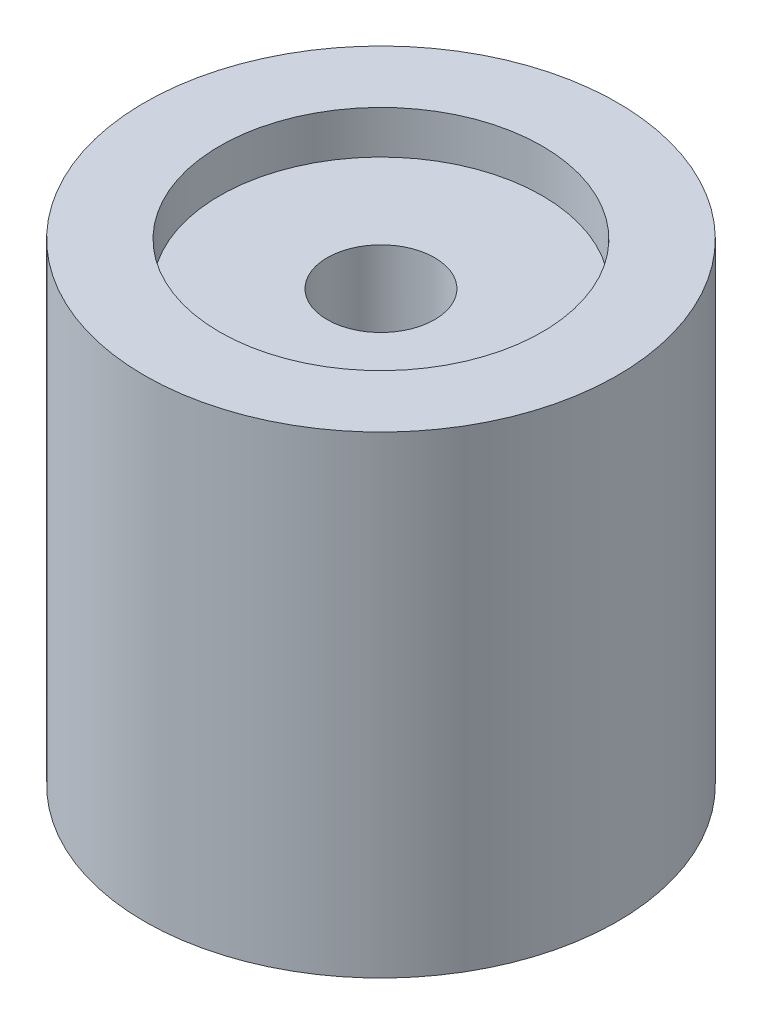
ISO-10303-21;
HEADER;
FILE_DESCRIPTION(('STEP AP214'),'2;1');
FILE_NAME('part.step','',(''),(''),'','','');
FILE_SCHEMA(('AUTOMOTIVE_DESIGN { 1 0 10303 214 1 1 1 1 }'));
ENDSEC;
DATA;
#1=APPLICATION_CONTEXT('core data for automotive mechanical design processes');
#2=APPLICATION_PROTOCOL_DEFINITION('international standard','automotive_design',2000,#1);
#3=PRODUCT_CONTEXT('',#1,'mechanical');
#4=PRODUCT('Part','Part','',(#3));
#5=PRODUCT_RELATED_PRODUCT_CATEGORY('part','',(#4));
#6=PRODUCT_DEFINITION_FORMATION('','',#4);
#7=PRODUCT_DEFINITION_CONTEXT('part definition',#1,'design');
#8=PRODUCT_DEFINITION('design','',#6,#7);
#9=PRODUCT_DEFINITION_SHAPE('','',#8);
#10=(LENGTH_UNIT() NAMED_UNIT(*) SI_UNIT(.MILLI.,.METRE.));
#11=(NAMED_UNIT(*) PLANE_ANGLE_UNIT() SI_UNIT($,.RADIAN.));
#12=(NAMED_UNIT(*) SI_UNIT($,.STERADIAN.) SOLID_ANGLE_UNIT());
#13=UNCERTAINTY_MEASURE_WITH_UNIT(LENGTH_MEASURE(1.E-05),#10,'distance_accuracy_value','');
#14=(GEOMETRIC_REPRESENTATION_CONTEXT(3) GLOBAL_UNCERTAINTY_ASSIGNED_CONTEXT((#13)) GLOBAL_UNIT_ASSIGNED_CONTEXT((#10,
#11,#12)) REPRESENTATION_CONTEXT('',''));
#15=CARTESIAN_POINT('',(0.,0.,0.));
#16=DIRECTION('',(0.,0.,1.));
#17=DIRECTION('',(1.,0.,0.));
#18=AXIS2_PLACEMENT_3D('',#15,#16,#17);
#19=CARTESIAN_POINT('',(0.,44.,0.));
#20=DIRECTION('',(0.,-1.,0.));
#21=DIRECTION('',(0.,0.,-1.));
#22=AXIS2_PLACEMENT_3D('',#19,#20,#21);
#23=CYLINDRICAL_SURFACE('',#22,5.);
#24=CARTESIAN_POINT('',(0.,40.,0.));
#25=DIRECTION('',(0.,1.,0.));
#26=DIRECTION('',(0.,0.,1.));
#27=AXIS2_PLACEMENT_3D('',#24,#25,#26);
#28=CIRCLE('',#27,5.);
#29=CARTESIAN_POINT('',(0.,40.,5.));
#30=VERTEX_POINT('',#29);
#31=EDGE_CURVE('E60',#30,#30,#28,.T.);
#32=ORIENTED_EDGE('',*,*,#31,.T.);
#33=EDGE_LOOP('',(#32));
#34=FACE_BOUND('',#33,.T.);
#35=CARTESIAN_POINT('',(0.,4.,0.));
#36=DIRECTION('',(0.,-1.,0.));
#37=DIRECTION('',(0.,0.,-1.));
#38=AXIS2_PLACEMENT_3D('',#35,#36,#37);
#39=CIRCLE('',#38,5.);
#40=CARTESIAN_POINT('',(0.,4.,-5.));
#41=VERTEX_POINT('',#40);
#42=EDGE_CURVE('E46',#41,#41,#39,.T.);
#43=ORIENTED_EDGE('',*,*,#42,.T.);
#44=EDGE_LOOP('',(#43));
#45=FACE_BOUND('',#44,.T.);
#46=ADVANCED_FACE('F45',(#34,#45),#23,.F.);
#47=CARTESIAN_POINT('',(0.,44.,0.));
#48=DIRECTION('',(0.,1.,0.));
#49=DIRECTION('',(0.,0.,1.));
#50=AXIS2_PLACEMENT_3D('',#47,#48,#49);
#51=PLANE('',#50);
#52=CARTESIAN_POINT('',(0.,44.,0.));
#53=DIRECTION('',(0.,1.,0.));
#54=DIRECTION('',(0.,0.,1.));
#55=AXIS2_PLACEMENT_3D('',#52,#53,#54);
#56=CIRCLE('',#55,15.);
#57=CARTESIAN_POINT('',(0.,44.,15.));
#58=VERTEX_POINT('',#57);
#59=EDGE_CURVE('E58',#58,#58,#56,.T.);
#60=ORIENTED_EDGE('',*,*,#59,.F.);
#61=EDGE_LOOP('',(#60));
#62=FACE_BOUND('',#61,.T.);
#63=CARTESIAN_POINT('',(0.,44.,0.));
#64=DIRECTION('',(0.,1.,0.));
#65=DIRECTION('',(0.,0.,1.));
#66=AXIS2_PLACEMENT_3D('',#63,#64,#65);
#67=CIRCLE('',#66,22.);
#68=CARTESIAN_POINT('',(0.,44.,22.));
#69=VERTEX_POINT('',#68);
#70=EDGE_CURVE('E10',#69,#69,#67,.T.);
#71=ORIENTED_EDGE('',*,*,#70,.T.);
#72=EDGE_LOOP('',(#71));
#73=FACE_BOUND('',#72,.T.);
#74=ADVANCED_FACE('F97',(#62,#73),#51,.T.);
#75=CARTESIAN_POINT('',(0.,0.,0.));
#76=DIRECTION('',(0.,1.,0.));
#77=DIRECTION('',(0.,0.,1.));
#78=AXIS2_PLACEMENT_3D('',#75,#76,#77);
#79=PLANE('',#78);
#80=CARTESIAN_POINT('',(0.,0.,0.));
#81=DIRECTION('',(0.,-1.,0.));
#82=DIRECTION('',(0.,0.,-1.));
#83=AXIS2_PLACEMENT_3D('',#80,#81,#82);
#84=CIRCLE('',#83,15.);
#85=CARTESIAN_POINT('',(0.,0.,-15.));
#86=VERTEX_POINT('',#85);
#87=EDGE_CURVE('E74',#86,#86,#84,.T.);
#88=ORIENTED_EDGE('',*,*,#87,.F.);
#89=EDGE_LOOP('',(#88));
#90=FACE_BOUND('',#89,.T.);
#91=CARTESIAN_POINT('',(0.,0.,0.));
#92=DIRECTION('',(0.,1.,0.));
#93=DIRECTION('',(0.,0.,1.));
#94=AXIS2_PLACEMENT_3D('',#91,#92,#93);
#95=CIRCLE('',#94,22.);
#96=CARTESIAN_POINT('',(0.,0.,22.));
#97=VERTEX_POINT('',#96);
#98=EDGE_CURVE('E51',#97,#97,#95,.T.);
#99=ORIENTED_EDGE('',*,*,#98,.F.);
#100=EDGE_LOOP('',(#99));
#101=FACE_BOUND('',#100,.T.);
#102=ADVANCED_FACE('F106',(#90,#101),#79,.F.);
#103=CARTESIAN_POINT('',(0.,44.,0.));
#104=DIRECTION('',(0.,-1.,0.));
#105=DIRECTION('',(0.,0.,-1.));
#106=AXIS2_PLACEMENT_3D('',#103,#104,#105);
#107=CYLINDRICAL_SURFACE('',#106,22.);
#108=ORIENTED_EDGE('',*,*,#70,.F.);
#109=EDGE_LOOP('',(#108));
#110=FACE_BOUND('',#109,.T.);
#111=ORIENTED_EDGE('',*,*,#98,.T.);
#112=EDGE_LOOP('',(#111));
#113=FACE_BOUND('',#112,.T.);
#114=ADVANCED_FACE('F42',(#110,#113),#107,.T.);
#115=CARTESIAN_POINT('',(0.,40.,0.));
#116=DIRECTION('',(0.,1.,0.));
#117=DIRECTION('',(0.,0.,1.));
#118=AXIS2_PLACEMENT_3D('',#115,#116,#117);
#119=CYLINDRICAL_SURFACE('',#118,15.);
#120=CARTESIAN_POINT('',(0.,40.,0.));
#121=DIRECTION('',(0.,1.,0.));
#122=DIRECTION('',(0.,0.,1.));
#123=AXIS2_PLACEMENT_3D('',#120,#121,#122);
#124=CIRCLE('',#123,15.);
#125=CARTESIAN_POINT('',(0.,40.,15.));
#126=VERTEX_POINT('',#125);
#127=EDGE_CURVE('E61',#126,#126,#124,.T.);
#128=ORIENTED_EDGE('',*,*,#127,.F.);
#129=EDGE_LOOP('',(#128));
#130=FACE_BOUND('',#129,.T.);
#131=ORIENTED_EDGE('',*,*,#59,.T.);
#132=EDGE_LOOP('',(#131));
#133=FACE_BOUND('',#132,.T.);
#134=ADVANCED_FACE('F109',(#130,#133),#119,.F.);
#135=CARTESIAN_POINT('',(0.,40.,0.));
#136=DIRECTION('',(0.,1.,0.));
#137=DIRECTION('',(0.,0.,1.));
#138=AXIS2_PLACEMENT_3D('',#135,#136,#137);
#139=PLANE('',#138);
#140=ORIENTED_EDGE('',*,*,#31,.F.);
#141=EDGE_LOOP('',(#140));
#142=FACE_BOUND('',#141,.T.);
#143=ORIENTED_EDGE('',*,*,#127,.T.);
#144=EDGE_LOOP('',(#143));
#145=FACE_BOUND('',#144,.T.);
#146=ADVANCED_FACE('F92',(#142,#145),#139,.T.);
#147=CARTESIAN_POINT('',(0.,4.,0.));
#148=DIRECTION('',(0.,-1.,0.));
#149=DIRECTION('',(0.,0.,-1.));
#150=AXIS2_PLACEMENT_3D('',#147,#148,#149);
#151=CYLINDRICAL_SURFACE('',#150,15.);
#152=CARTESIAN_POINT('',(0.,4.,0.));
#153=DIRECTION('',(0.,-1.,0.));
#154=DIRECTION('',(0.,0.,-1.));
#155=AXIS2_PLACEMENT_3D('',#152,#153,#154);
#156=CIRCLE('',#155,15.);
#157=CARTESIAN_POINT('',(0.,4.,-15.));
#158=VERTEX_POINT('',#157);
#159=EDGE_CURVE('E79',#158,#158,#156,.T.);
#160=ORIENTED_EDGE('',*,*,#159,.F.);
#161=EDGE_LOOP('',(#160));
#162=FACE_BOUND('',#161,.T.);
#163=ORIENTED_EDGE('',*,*,#87,.T.);
#164=EDGE_LOOP('',(#163));
#165=FACE_BOUND('',#164,.T.);
#166=ADVANCED_FACE('F89',(#162,#165),#151,.F.);
#167=CARTESIAN_POINT('',(0.,4.,0.));
#168=DIRECTION('',(0.,-1.,0.));
#169=DIRECTION('',(0.,0.,-1.));
#170=AXIS2_PLACEMENT_3D('',#167,#168,#169);
#171=PLANE('',#170);
#172=ORIENTED_EDGE('',*,*,#42,.F.);
#173=EDGE_LOOP('',(#172));
#174=FACE_BOUND('',#173,.T.);
#175=ORIENTED_EDGE('',*,*,#159,.T.);
#176=EDGE_LOOP('',(#175));
#177=FACE_BOUND('',#176,.T.);
#178=ADVANCED_FACE('F86',(#174,#177),#171,.T.);
#179=CLOSED_SHELL('',(#46,#74,#102,#114,#134,#146,#166,#178));
#180=MANIFOLD_SOLID_BREP('B2',#179);
#181=ADVANCED_BREP_SHAPE_REPRESENTATION('',(#18,#180),#14);
#182=SHAPE_DEFINITION_REPRESENTATION(#9,#181);
ENDSEC;
END-ISO-10303-21;
